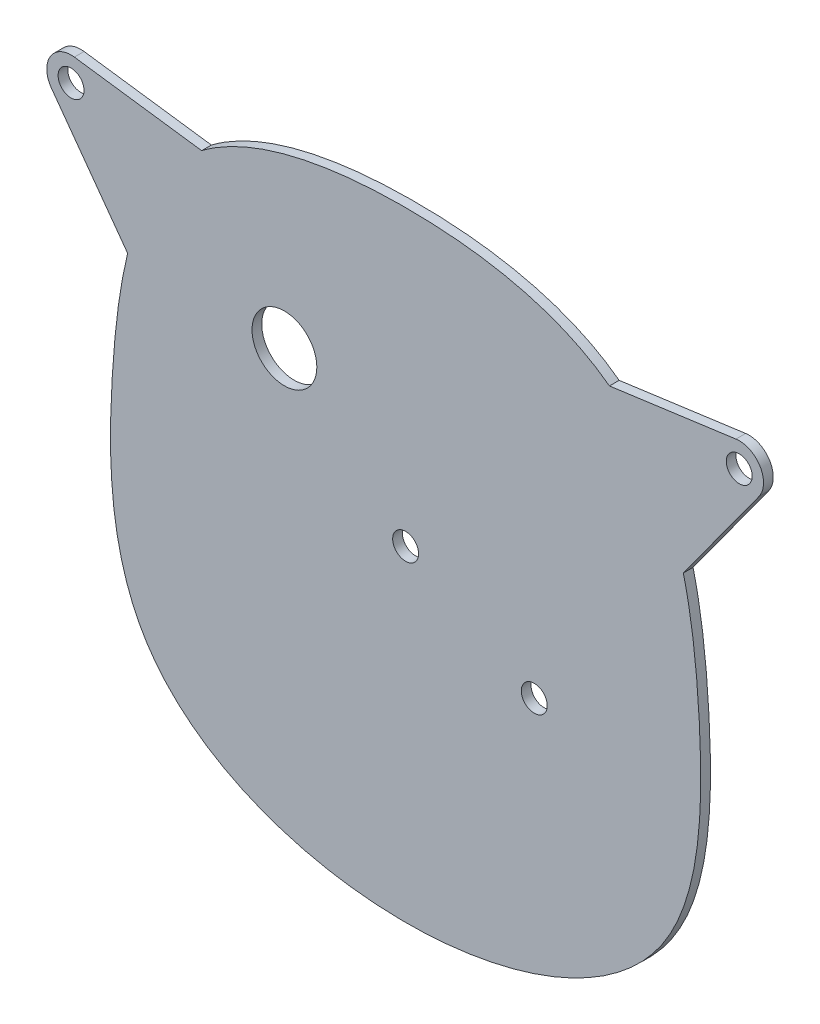
ISO-10303-21;
HEADER;
FILE_DESCRIPTION(('STEP AP214'),'2;1');
FILE_NAME('part.step','',(''),(''),'','','');
FILE_SCHEMA(('AUTOMOTIVE_DESIGN { 1 0 10303 214 1 1 1 1 }'));
ENDSEC;
DATA;
#1=APPLICATION_CONTEXT('core data for automotive mechanical design processes');
#2=APPLICATION_PROTOCOL_DEFINITION('international standard','automotive_design',2000,#1);
#3=PRODUCT_CONTEXT('',#1,'mechanical');
#4=PRODUCT('Part','Part','',(#3));
#5=PRODUCT_RELATED_PRODUCT_CATEGORY('part','',(#4));
#6=PRODUCT_DEFINITION_FORMATION('','',#4);
#7=PRODUCT_DEFINITION_CONTEXT('part definition',#1,'design');
#8=PRODUCT_DEFINITION('design','',#6,#7);
#9=PRODUCT_DEFINITION_SHAPE('','',#8);
#10=(LENGTH_UNIT() NAMED_UNIT(*) SI_UNIT(.MILLI.,.METRE.));
#11=(NAMED_UNIT(*) PLANE_ANGLE_UNIT() SI_UNIT($,.RADIAN.));
#12=(NAMED_UNIT(*) SI_UNIT($,.STERADIAN.) SOLID_ANGLE_UNIT());
#13=UNCERTAINTY_MEASURE_WITH_UNIT(LENGTH_MEASURE(1.E-05),#10,'distance_accuracy_value','');
#14=(GEOMETRIC_REPRESENTATION_CONTEXT(3) GLOBAL_UNCERTAINTY_ASSIGNED_CONTEXT((#13)) GLOBAL_UNIT_ASSIGNED_CONTEXT((#10,
#11,#12)) REPRESENTATION_CONTEXT('',''));
#15=CARTESIAN_POINT('',(0.,0.,0.));
#16=DIRECTION('',(0.,0.,1.));
#17=DIRECTION('',(1.,0.,0.));
#18=AXIS2_PLACEMENT_3D('',#15,#16,#17);
#19=CARTESIAN_POINT('',(-0.0577550519054268,95.5603656816354,3.));
#20=DIRECTION('',(0.,0.,1.));
#21=DIRECTION('',(1.,0.,0.));
#22=AXIS2_PLACEMENT_3D('',#19,#20,#21);
#23=PLANE('',#22);
#24=CARTESIAN_POINT('',(102.883543247524,77.2362190383587,3.));
#25=DIRECTION('',(0.,0.,1.));
#26=DIRECTION('',(1.,0.,0.));
#27=AXIS2_PLACEMENT_3D('',#24,#25,#26);
#28=CIRCLE('',#27,4.00000000000001);
#29=CARTESIAN_POINT('',(106.883543247524,77.2362190383587,3.));
#30=VERTEX_POINT('',#29);
#31=EDGE_CURVE('E339',#30,#30,#28,.T.);
#32=ORIENTED_EDGE('',*,*,#31,.F.);
#33=EDGE_LOOP('',(#32));
#34=FACE_BOUND('',#33,.T.);
#35=CARTESIAN_POINT('',(39.6608312378982,-15.6887366735014,3.));
#36=DIRECTION('',(0.,0.,1.));
#37=DIRECTION('',(1.,0.,0.));
#38=AXIS2_PLACEMENT_3D('',#35,#36,#37);
#39=CIRCLE('',#38,4.0000000115835);
#40=CARTESIAN_POINT('',(43.6608312494817,-15.6887366735014,3.));
#41=VERTEX_POINT('',#40);
#42=EDGE_CURVE('E351',#41,#41,#39,.T.);
#43=ORIENTED_EDGE('',*,*,#42,.F.);
#44=EDGE_LOOP('',(#43));
#45=FACE_BOUND('',#44,.T.);
#46=CARTESIAN_POINT('',(62.8512042395598,79.3404872355241,3.));
#47=CARTESIAN_POINT('',(60.8879174687472,80.8200655627939,3.));
#48=CARTESIAN_POINT('',(53.8097674375605,85.4517683193398,3.));
#49=CARTESIAN_POINT('',(39.8663605925617,91.1117371513544,3.));
#50=CARTESIAN_POINT('',(20.4248934275939,94.8529199799036,3.));
#51=CARTESIAN_POINT('',(6.79160473756205,95.5603683978794,3.));
#52=CARTESIAN_POINT('',(-0.0250396074538525,95.5603683978794,3.));
#53=CARTESIAN_POINT('',(-6.84168395246976,95.5603683978794,3.));
#54=CARTESIAN_POINT('',(-20.4749726425016,94.8529199799036,3.));
#55=CARTESIAN_POINT('',(-39.9164398074694,91.1117371513545,3.));
#56=CARTESIAN_POINT('',(-53.8783269469801,85.4442667171771,3.));
#57=CARTESIAN_POINT('',(-60.9700219168418,80.7990989413774,3.));
#58=CARTESIAN_POINT('',(-62.9467747967644,79.3061670478501,3.));
#59=B_SPLINE_CURVE_WITH_KNOTS('',3,(#46,#47,#48,#49,#50,#51,#52,#53,#54,#55,#56,#57,#58),
.UNSPECIFIED.,.F.,.F.,(4,1,1,1,3,1,1,1,4),(0.893210136455456,0.90615001359331,0.93740001359331,
0.96865001359331,0.99990001359331,1.03115001359331,1.06240001359331,1.09365001359331,
1.10668987713785),.UNSPECIFIED.);
#60=CARTESIAN_POINT('',(62.8512042395598,79.3404872355241,3.));
#61=VERTEX_POINT('',#60);
#62=CARTESIAN_POINT('',(-62.9467747967644,79.3061670478501,3.));
#63=VERTEX_POINT('',#62);
#64=EDGE_CURVE('E156',#61,#63,#59,.T.);
#65=ORIENTED_EDGE('',*,*,#64,.T.);
#66=DIRECTION('',(-0.990809124231326,0.135267436362018,0.));
#67=VECTOR('',#66,1.);
#68=CARTESIAN_POINT('',(-62.9467747967644,79.3061670478501,3.));
#69=LINE('',#68,#67);
#70=CARTESIAN_POINT('',(-102.215997092559,84.6672874674903,3.));
#71=VERTEX_POINT('',#70);
#72=EDGE_CURVE('E94',#63,#71,#69,.T.);
#73=ORIENTED_EDGE('',*,*,#72,.T.);
#74=CARTESIAN_POINT('',(-103.23050286541,77.236219034758,3.));
#75=DIRECTION('',(0.,0.,1.));
#76=DIRECTION('',(1.,0.,0.));
#77=AXIS2_PLACEMENT_3D('',#74,#75,#76);
#78=CIRCLE('',#77,7.50000000100651);
#79=CARTESIAN_POINT('',(-109.297018411226,72.8262996310193,3.));
#80=VERTEX_POINT('',#79);
#81=EDGE_CURVE('E171',#71,#80,#78,.T.);
#82=ORIENTED_EDGE('',*,*,#81,.T.);
#83=DIRECTION('',(0.58798925375293,-0.808868739333566,0.));
#84=VECTOR('',#83,1.);
#85=CARTESIAN_POINT('',(-109.297018411226,72.8262996310193,3.));
#86=LINE('',#85,#84);
#87=CARTESIAN_POINT('',(-85.7735669249831,40.4662106889059,3.));
#88=VERTEX_POINT('',#87);
#89=EDGE_CURVE('E184',#80,#88,#86,.T.);
#90=ORIENTED_EDGE('',*,*,#89,.T.);
#91=CARTESIAN_POINT('',(-85.7735669249831,40.4662106889059,3.));
#92=CARTESIAN_POINT('',(-85.8511091783791,40.1485115314779,3.));
#93=CARTESIAN_POINT('',(-87.4250450361891,33.5866055212239,3.));
#94=CARTESIAN_POINT('',(-89.0322127667217,23.4613451281537,3.));
#95=CARTESIAN_POINT('',(-90.2390196490967,10.1127233092552,3.));
#96=CARTESIAN_POINT('',(-91.0484650788275,-3.23978660476637,3.));
#97=CARTESIAN_POINT('',(-91.2741268025938,-19.8199296303688,3.));
#98=CARTESIAN_POINT('',(-89.5078461447433,-35.6085090177251,3.));
#99=CARTESIAN_POINT('',(-86.3394473294779,-47.3832895066007,3.));
#100=CARTESIAN_POINT('',(-82.9401382188529,-55.6782895298871,3.));
#101=CARTESIAN_POINT('',(-78.3435141502608,-63.3250522266594,3.));
#102=CARTESIAN_POINT('',(-70.5893497709855,-72.4184139893043,3.));
#103=CARTESIAN_POINT('',(-58.3170135581357,-81.7179417703992,3.));
#104=CARTESIAN_POINT('',(-40.5556573062878,-89.639515512568,3.));
#105=CARTESIAN_POINT('',(-20.7915722708147,-94.3834430600468,3.));
#106=CARTESIAN_POINT('',(-0.0250396074538563,-95.9677258731575,3.));
#107=CARTESIAN_POINT('',(20.7414930559071,-94.3834430600468,3.));
#108=CARTESIAN_POINT('',(40.5055780913801,-89.6395155125679,3.));
#109=CARTESIAN_POINT('',(58.266934343228,-81.7179417703992,3.));
#110=CARTESIAN_POINT('',(70.5392705560778,-72.4184139893043,3.));
#111=CARTESIAN_POINT('',(78.2934349353531,-63.3250522266595,3.));
#112=CARTESIAN_POINT('',(82.8900590039453,-55.6782895298871,3.));
#113=CARTESIAN_POINT('',(86.2893681145702,-47.3832895066007,3.));
#114=CARTESIAN_POINT('',(89.4577669298356,-35.6085090177251,3.));
#115=CARTESIAN_POINT('',(91.2240475876861,-19.8199296303689,3.));
#116=CARTESIAN_POINT('',(90.9983858639199,-3.23978660476641,3.));
#117=CARTESIAN_POINT('',(90.188940434189,10.1127233092552,3.));
#118=CARTESIAN_POINT('',(88.982133551814,23.4613451281536,3.));
#119=CARTESIAN_POINT('',(87.3580235646654,33.6933428309795,3.));
#120=CARTESIAN_POINT('',(85.7519419609067,40.3526029865284,3.));
#121=CARTESIAN_POINT('',(85.6485523501818,40.7715298828133,3.));
#122=B_SPLINE_CURVE_WITH_KNOTS('',3,(#91,#92,#93,#94,#95,#96,#97,#98,#99,#100,#101,#102,#103,
#104,#105,#106,#107,#108,#109,#110,#111,#112,#113,#114,#115,#116,#117,#118,#119,#120,#121),
.UNSPECIFIED.,.F.,.F.,(4,1,1,1,1,1,1,1,1,1,1,1,1,1,1,1,1,1,1,1,1,1,1,1,1,1,1,1,4),
(1.18539525333421,1.18698905711832,1.21823905711832,1.23386405711832,1.24948905711832,
1.28073905711832,1.31198905711832,1.32761405711832,1.34323905711832,1.35886405711832,
1.37448905711832,1.40573905711832,1.43698905711832,1.46823905711832,1.49948905711832,
1.53073905711832,1.56198905711832,1.59323905711832,1.62448905711832,1.64011405711832,
1.65573905711832,1.67136405711832,1.68698905711832,1.71823905711832,1.74948905711832,
1.76511405711832,1.78073905711832,1.81198905711832,1.81409380378411),.UNSPECIFIED.);
#123=CARTESIAN_POINT('',(85.6485523501818,40.7715298828133,3.));
#124=VERTEX_POINT('',#123);
#125=EDGE_CURVE('E113',#88,#124,#122,.T.);
#126=ORIENTED_EDGE('',*,*,#125,.T.);
#127=DIRECTION('',(0.58798925364388,0.808868739412838,0.));
#128=VECTOR('',#127,1.);
#129=CARTESIAN_POINT('',(108.950058787674,72.8262996285369,3.));
#130=LINE('',#129,#128);
#131=CARTESIAN_POINT('',(108.950058787674,72.8262996285369,3.));
#132=VERTEX_POINT('',#131);
#133=EDGE_CURVE('E107',#124,#132,#130,.T.);
#134=ORIENTED_EDGE('',*,*,#133,.T.);
#135=CARTESIAN_POINT('',(102.883543247524,77.2362190383587,3.));
#136=DIRECTION('',(0.,0.,1.));
#137=DIRECTION('',(1.,0.,0.));
#138=AXIS2_PLACEMENT_3D('',#135,#136,#137);
#139=CIRCLE('',#138,7.5000000000005);
#140=CARTESIAN_POINT('',(101.869037469125,84.6672874693183,3.));
#141=VERTEX_POINT('',#140);
#142=EDGE_CURVE('E111',#132,#141,#139,.T.);
#143=ORIENTED_EDGE('',*,*,#142,.T.);
#144=DIRECTION('',(-0.990809124227078,-0.135267436393135,0.));
#145=VECTOR('',#144,1.);
#146=CARTESIAN_POINT('',(62.8512042395598,79.3404872355241,3.));
#147=LINE('',#146,#145);
#148=EDGE_CURVE('E51',#141,#61,#147,.T.);
#149=ORIENTED_EDGE('',*,*,#148,.T.);
#150=EDGE_LOOP('',(#65,#73,#82,#90,#126,#134,#143,#149));
#151=FACE_BOUND('',#150,.T.);
#152=CARTESIAN_POINT('',(-0.0250396149657495,5.06036839965765,3.));
#153=DIRECTION('',(0.,0.,1.));
#154=DIRECTION('',(1.,0.,0.));
#155=AXIS2_PLACEMENT_3D('',#152,#153,#154);
#156=CIRCLE('',#155,4.);
#157=CARTESIAN_POINT('',(3.97496038503425,5.06036839965765,3.));
#158=VERTEX_POINT('',#157);
#159=EDGE_CURVE('E137',#158,#158,#156,.T.);
#160=ORIENTED_EDGE('',*,*,#159,.F.);
#161=EDGE_LOOP('',(#160));
#162=FACE_BOUND('',#161,.T.);
#163=CARTESIAN_POINT('',(-103.23050286541,77.236219034758,3.));
#164=DIRECTION('',(0.,0.,1.));
#165=DIRECTION('',(1.,0.,0.));
#166=AXIS2_PLACEMENT_3D('',#163,#164,#165);
#167=CIRCLE('',#166,4.00000000000001);
#168=CARTESIAN_POINT('',(-99.2305028654102,77.236219034758,3.));
#169=VERTEX_POINT('',#168);
#170=EDGE_CURVE('E345',#169,#169,#167,.T.);
#171=ORIENTED_EDGE('',*,*,#170,.F.);
#172=EDGE_LOOP('',(#171));
#173=FACE_BOUND('',#172,.T.);
#174=CARTESIAN_POINT('',(-37.4125721764809,39.2362190367203,3.));
#175=DIRECTION('',(0.,0.,1.));
#176=DIRECTION('',(1.,0.,0.));
#177=AXIS2_PLACEMENT_3D('',#174,#175,#176);
#178=CIRCLE('',#177,10.);
#179=CARTESIAN_POINT('',(-27.4125721764809,39.2362190367203,3.));
#180=VERTEX_POINT('',#179);
#181=EDGE_CURVE('E330',#180,#180,#178,.T.);
#182=ORIENTED_EDGE('',*,*,#181,.F.);
#183=EDGE_LOOP('',(#182));
#184=FACE_BOUND('',#183,.T.);
#185=ADVANCED_FACE('F33',(#34,#45,#151,#162,#173,#184),#23,.T.);
#186=CARTESIAN_POINT('',(-0.0577550519054268,95.5603656816354,0.));
#187=DIRECTION('',(0.,0.,1.));
#188=DIRECTION('',(1.,0.,0.));
#189=AXIS2_PLACEMENT_3D('',#186,#187,#188);
#190=PLANE('',#189);
#191=CARTESIAN_POINT('',(62.8512042395598,79.3404872355241,0.));
#192=CARTESIAN_POINT('',(60.8879174687472,80.8200655627939,0.));
#193=CARTESIAN_POINT('',(53.8097674375605,85.4517683193398,0.));
#194=CARTESIAN_POINT('',(39.8663605925617,91.1117371513544,0.));
#195=CARTESIAN_POINT('',(20.4248934275939,94.8529199799036,0.));
#196=CARTESIAN_POINT('',(6.79160473756205,95.5603683978794,0.));
#197=CARTESIAN_POINT('',(-0.0250396074538525,95.5603683978794,0.));
#198=CARTESIAN_POINT('',(-6.84168395246976,95.5603683978794,0.));
#199=CARTESIAN_POINT('',(-20.4749726425016,94.8529199799036,0.));
#200=CARTESIAN_POINT('',(-39.9164398074694,91.1117371513545,0.));
#201=CARTESIAN_POINT('',(-53.8783269469801,85.4442667171771,0.));
#202=CARTESIAN_POINT('',(-60.9700219168418,80.7990989413774,0.));
#203=CARTESIAN_POINT('',(-62.9467747967644,79.3061670478501,0.));
#204=B_SPLINE_CURVE_WITH_KNOTS('',3,(#191,#192,#193,#194,#195,#196,#197,#198,#199,#200,#201,
#202,#203),.UNSPECIFIED.,.F.,.F.,(4,1,1,1,3,1,1,1,4),(0.893210136455456,0.90615001359331,
0.93740001359331,0.96865001359331,0.99990001359331,1.03115001359331,1.06240001359331,
1.09365001359331,1.10668987713785),.UNSPECIFIED.);
#205=CARTESIAN_POINT('',(62.8512042395598,79.3404872355241,0.));
#206=VERTEX_POINT('',#205);
#207=CARTESIAN_POINT('',(-62.9467747967644,79.3061670478501,0.));
#208=VERTEX_POINT('',#207);
#209=EDGE_CURVE('E131',#206,#208,#204,.T.);
#210=ORIENTED_EDGE('',*,*,#209,.F.);
#211=DIRECTION('',(-0.990809124227078,-0.135267436393135,0.));
#212=VECTOR('',#211,1.);
#213=CARTESIAN_POINT('',(62.8512042395598,79.3404872355241,0.));
#214=LINE('',#213,#212);
#215=CARTESIAN_POINT('',(101.869037469125,84.6672874693183,0.));
#216=VERTEX_POINT('',#215);
#217=EDGE_CURVE('E86',#216,#206,#214,.T.);
#218=ORIENTED_EDGE('',*,*,#217,.F.);
#219=CARTESIAN_POINT('',(102.883543247524,77.2362190383587,0.));
#220=DIRECTION('',(0.,0.,1.));
#221=DIRECTION('',(1.,0.,0.));
#222=AXIS2_PLACEMENT_3D('',#219,#220,#221);
#223=CIRCLE('',#222,7.5000000000005);
#224=CARTESIAN_POINT('',(108.950058787674,72.8262996285369,0.));
#225=VERTEX_POINT('',#224);
#226=EDGE_CURVE('E80',#225,#216,#223,.T.);
#227=ORIENTED_EDGE('',*,*,#226,.F.);
#228=DIRECTION('',(0.58798925364388,0.808868739412838,0.));
#229=VECTOR('',#228,1.);
#230=CARTESIAN_POINT('',(108.950058787674,72.8262996285369,0.));
#231=LINE('',#230,#229);
#232=CARTESIAN_POINT('',(85.6485523501818,40.7715298828133,0.));
#233=VERTEX_POINT('',#232);
#234=EDGE_CURVE('E121',#233,#225,#231,.T.);
#235=ORIENTED_EDGE('',*,*,#234,.F.);
#236=CARTESIAN_POINT('',(-85.7735669249831,40.4662106889059,0.));
#237=CARTESIAN_POINT('',(-85.8511091783791,40.1485115314779,0.));
#238=CARTESIAN_POINT('',(-87.4250450361891,33.5866055212239,0.));
#239=CARTESIAN_POINT('',(-89.0322127667217,23.4613451281537,0.));
#240=CARTESIAN_POINT('',(-90.2390196490967,10.1127233092552,0.));
#241=CARTESIAN_POINT('',(-91.0484650788275,-3.23978660476637,0.));
#242=CARTESIAN_POINT('',(-91.2741268025938,-19.8199296303688,0.));
#243=CARTESIAN_POINT('',(-89.5078461447433,-35.6085090177251,0.));
#244=CARTESIAN_POINT('',(-86.3394473294779,-47.3832895066007,0.));
#245=CARTESIAN_POINT('',(-82.9401382188529,-55.6782895298871,0.));
#246=CARTESIAN_POINT('',(-78.3435141502608,-63.3250522266594,0.));
#247=CARTESIAN_POINT('',(-70.5893497709855,-72.4184139893043,0.));
#248=CARTESIAN_POINT('',(-58.3170135581357,-81.7179417703992,0.));
#249=CARTESIAN_POINT('',(-40.5556573062878,-89.639515512568,0.));
#250=CARTESIAN_POINT('',(-20.7915722708147,-94.3834430600468,0.));
#251=CARTESIAN_POINT('',(-0.0250396074538563,-95.9677258731575,0.));
#252=CARTESIAN_POINT('',(20.7414930559071,-94.3834430600468,0.));
#253=CARTESIAN_POINT('',(40.5055780913801,-89.6395155125679,0.));
#254=CARTESIAN_POINT('',(58.266934343228,-81.7179417703992,0.));
#255=CARTESIAN_POINT('',(70.5392705560778,-72.4184139893043,0.));
#256=CARTESIAN_POINT('',(78.2934349353531,-63.3250522266595,0.));
#257=CARTESIAN_POINT('',(82.8900590039453,-55.6782895298871,0.));
#258=CARTESIAN_POINT('',(86.2893681145702,-47.3832895066007,0.));
#259=CARTESIAN_POINT('',(89.4577669298356,-35.6085090177251,0.));
#260=CARTESIAN_POINT('',(91.2240475876861,-19.8199296303689,0.));
#261=CARTESIAN_POINT('',(90.9983858639199,-3.23978660476641,0.));
#262=CARTESIAN_POINT('',(90.188940434189,10.1127233092552,0.));
#263=CARTESIAN_POINT('',(88.982133551814,23.4613451281536,0.));
#264=CARTESIAN_POINT('',(87.3580235646654,33.6933428309795,0.));
#265=CARTESIAN_POINT('',(85.7519419609067,40.3526029865284,0.));
#266=CARTESIAN_POINT('',(85.6485523501818,40.7715298828133,0.));
#267=B_SPLINE_CURVE_WITH_KNOTS('',3,(#236,#237,#238,#239,#240,#241,#242,#243,#244,#245,#246,
#247,#248,#249,#250,#251,#252,#253,#254,#255,#256,#257,#258,#259,#260,#261,#262,#263,#264,#265,
#266),.UNSPECIFIED.,.F.,.F.,(4,1,1,1,1,1,1,1,1,1,1,1,1,1,1,1,1,1,1,1,1,1,1,1,1,1,1,1,4),
(1.18539525333421,1.18698905711832,1.21823905711832,1.23386405711832,1.24948905711832,
1.28073905711832,1.31198905711832,1.32761405711832,1.34323905711832,1.35886405711832,
1.37448905711832,1.40573905711832,1.43698905711832,1.46823905711832,1.49948905711832,
1.53073905711832,1.56198905711832,1.59323905711832,1.62448905711832,1.64011405711832,
1.65573905711832,1.67136405711832,1.68698905711832,1.71823905711832,1.74948905711832,
1.76511405711832,1.78073905711832,1.81198905711832,1.81409380378411),.UNSPECIFIED.);
#268=CARTESIAN_POINT('',(-85.7735669249831,40.4662106889059,0.));
#269=VERTEX_POINT('',#268);
#270=EDGE_CURVE('E146',#269,#233,#267,.T.);
#271=ORIENTED_EDGE('',*,*,#270,.F.);
#272=DIRECTION('',(0.58798925375293,-0.808868739333566,0.));
#273=VECTOR('',#272,1.);
#274=CARTESIAN_POINT('',(-109.297018411226,72.8262996310193,0.));
#275=LINE('',#274,#273);
#276=CARTESIAN_POINT('',(-109.297018411226,72.8262996310193,0.));
#277=VERTEX_POINT('',#276);
#278=EDGE_CURVE('E144',#277,#269,#275,.T.);
#279=ORIENTED_EDGE('',*,*,#278,.F.);
#280=CARTESIAN_POINT('',(-103.23050286541,77.236219034758,0.));
#281=DIRECTION('',(0.,0.,1.));
#282=DIRECTION('',(1.,0.,0.));
#283=AXIS2_PLACEMENT_3D('',#280,#281,#282);
#284=CIRCLE('',#283,7.50000000100651);
#285=CARTESIAN_POINT('',(-102.215997092559,84.6672874674903,0.));
#286=VERTEX_POINT('',#285);
#287=EDGE_CURVE('E142',#286,#277,#284,.T.);
#288=ORIENTED_EDGE('',*,*,#287,.F.);
#289=DIRECTION('',(-0.990809124231326,0.135267436362018,0.));
#290=VECTOR('',#289,1.);
#291=CARTESIAN_POINT('',(-62.9467747967644,79.3061670478501,0.));
#292=LINE('',#291,#290);
#293=EDGE_CURVE('E136',#208,#286,#292,.T.);
#294=ORIENTED_EDGE('',*,*,#293,.F.);
#295=EDGE_LOOP('',(#210,#218,#227,#235,#271,#279,#288,#294));
#296=FACE_BOUND('',#295,.T.);
#297=CARTESIAN_POINT('',(-0.0250396149657495,5.06036839965765,0.));
#298=DIRECTION('',(0.,0.,1.));
#299=DIRECTION('',(1.,0.,0.));
#300=AXIS2_PLACEMENT_3D('',#297,#298,#299);
#301=CIRCLE('',#300,4.);
#302=CARTESIAN_POINT('',(3.97496038503425,5.06036839965765,0.));
#303=VERTEX_POINT('',#302);
#304=EDGE_CURVE('E354',#303,#303,#301,.T.);
#305=ORIENTED_EDGE('',*,*,#304,.T.);
#306=EDGE_LOOP('',(#305));
#307=FACE_BOUND('',#306,.T.);
#308=CARTESIAN_POINT('',(39.6608312378982,-15.6887366735014,0.));
#309=DIRECTION('',(0.,0.,1.));
#310=DIRECTION('',(1.,0.,0.));
#311=AXIS2_PLACEMENT_3D('',#308,#309,#310);
#312=CIRCLE('',#311,4.0000000115835);
#313=CARTESIAN_POINT('',(43.6608312494817,-15.6887366735014,0.));
#314=VERTEX_POINT('',#313);
#315=EDGE_CURVE('E348',#314,#314,#312,.T.);
#316=ORIENTED_EDGE('',*,*,#315,.T.);
#317=EDGE_LOOP('',(#316));
#318=FACE_BOUND('',#317,.T.);
#319=CARTESIAN_POINT('',(-103.23050286541,77.236219034758,0.));
#320=DIRECTION('',(0.,0.,1.));
#321=DIRECTION('',(1.,0.,0.));
#322=AXIS2_PLACEMENT_3D('',#319,#320,#321);
#323=CIRCLE('',#322,4.00000000000001);
#324=CARTESIAN_POINT('',(-99.2305028654102,77.236219034758,0.));
#325=VERTEX_POINT('',#324);
#326=EDGE_CURVE('E342',#325,#325,#323,.T.);
#327=ORIENTED_EDGE('',*,*,#326,.T.);
#328=EDGE_LOOP('',(#327));
#329=FACE_BOUND('',#328,.T.);
#330=CARTESIAN_POINT('',(102.883543247524,77.2362190383587,0.));
#331=DIRECTION('',(0.,0.,1.));
#332=DIRECTION('',(1.,0.,0.));
#333=AXIS2_PLACEMENT_3D('',#330,#331,#332);
#334=CIRCLE('',#333,4.00000000000001);
#335=CARTESIAN_POINT('',(106.883543247524,77.2362190383587,0.));
#336=VERTEX_POINT('',#335);
#337=EDGE_CURVE('E336',#336,#336,#334,.T.);
#338=ORIENTED_EDGE('',*,*,#337,.T.);
#339=EDGE_LOOP('',(#338));
#340=FACE_BOUND('',#339,.T.);
#341=CARTESIAN_POINT('',(-37.4125721764809,39.2362190367203,0.));
#342=DIRECTION('',(0.,0.,1.));
#343=DIRECTION('',(1.,0.,0.));
#344=AXIS2_PLACEMENT_3D('',#341,#342,#343);
#345=CIRCLE('',#344,10.);
#346=CARTESIAN_POINT('',(-27.4125721764809,39.2362190367203,0.));
#347=VERTEX_POINT('',#346);
#348=EDGE_CURVE('E333',#347,#347,#345,.T.);
#349=ORIENTED_EDGE('',*,*,#348,.T.);
#350=EDGE_LOOP('',(#349));
#351=FACE_BOUND('',#350,.T.);
#352=ADVANCED_FACE('F175',(#296,#307,#318,#329,#340,#351),#190,.F.);
#353=DIRECTION('',(0.,0.,-1.));
#354=VECTOR('',#353,1.);
#355=SURFACE_OF_LINEAR_EXTRUSION('',#59,#354);
#356=ORIENTED_EDGE('',*,*,#209,.T.);
#357=DIRECTION('',(0.,0.,-1.));
#358=VECTOR('',#357,1.);
#359=CARTESIAN_POINT('',(-62.9467747967644,79.3061670478501,3.));
#360=LINE('',#359,#358);
#361=EDGE_CURVE('E11',#63,#208,#360,.T.);
#362=ORIENTED_EDGE('',*,*,#361,.F.);
#363=ORIENTED_EDGE('',*,*,#64,.F.);
#364=DIRECTION('',(0.,0.,-1.));
#365=VECTOR('',#364,1.);
#366=CARTESIAN_POINT('',(62.8512042395598,79.3404872355241,3.));
#367=LINE('',#366,#365);
#368=EDGE_CURVE('E127',#61,#206,#367,.T.);
#369=ORIENTED_EDGE('',*,*,#368,.T.);
#370=EDGE_LOOP('',(#356,#362,#363,#369));
#371=FACE_BOUND('',#370,.T.);
#372=ADVANCED_FACE('F35',(#371),#355,.F.);
#373=CARTESIAN_POINT('',(-62.9467747967644,79.3061670478501,3.));
#374=DIRECTION('',(-0.135267436362018,-0.990809124231326,0.));
#375=DIRECTION('',(0.990809124231326,-0.135267436362018,0.));
#376=AXIS2_PLACEMENT_3D('',#373,#374,#375);
#377=PLANE('',#376);
#378=ORIENTED_EDGE('',*,*,#293,.T.);
#379=DIRECTION('',(0.,0.,-1.));
#380=VECTOR('',#379,1.);
#381=CARTESIAN_POINT('',(-102.215997092559,84.6672874674903,3.));
#382=LINE('',#381,#380);
#383=EDGE_CURVE('E43',#71,#286,#382,.T.);
#384=ORIENTED_EDGE('',*,*,#383,.F.);
#385=ORIENTED_EDGE('',*,*,#72,.F.);
#386=ORIENTED_EDGE('',*,*,#361,.T.);
#387=EDGE_LOOP('',(#378,#384,#385,#386));
#388=FACE_BOUND('',#387,.T.);
#389=ADVANCED_FACE('F201',(#388),#377,.F.);
#390=CARTESIAN_POINT('',(-103.23050286541,77.236219034758,3.));
#391=DIRECTION('',(0.,0.,-1.));
#392=DIRECTION('',(-1.,0.,0.));
#393=AXIS2_PLACEMENT_3D('',#390,#391,#392);
#394=CYLINDRICAL_SURFACE('',#393,7.50000000100651);
#395=ORIENTED_EDGE('',*,*,#287,.T.);
#396=DIRECTION('',(0.,0.,-1.));
#397=VECTOR('',#396,1.);
#398=CARTESIAN_POINT('',(-109.297018411226,72.8262996310193,3.));
#399=LINE('',#398,#397);
#400=EDGE_CURVE('E163',#80,#277,#399,.T.);
#401=ORIENTED_EDGE('',*,*,#400,.F.);
#402=ORIENTED_EDGE('',*,*,#81,.F.);
#403=ORIENTED_EDGE('',*,*,#383,.T.);
#404=EDGE_LOOP('',(#395,#401,#402,#403));
#405=FACE_BOUND('',#404,.T.);
#406=ADVANCED_FACE('F169',(#405),#394,.T.);
#407=CARTESIAN_POINT('',(-109.297018411226,72.8262996310193,3.));
#408=DIRECTION('',(0.808868739333566,0.58798925375293,0.));
#409=DIRECTION('',(-0.58798925375293,0.808868739333566,0.));
#410=AXIS2_PLACEMENT_3D('',#407,#408,#409);
#411=PLANE('',#410);
#412=ORIENTED_EDGE('',*,*,#278,.T.);
#413=DIRECTION('',(0.,0.,-1.));
#414=VECTOR('',#413,1.);
#415=CARTESIAN_POINT('',(-85.7735669249831,40.4662106889059,3.));
#416=LINE('',#415,#414);
#417=EDGE_CURVE('E160',#88,#269,#416,.T.);
#418=ORIENTED_EDGE('',*,*,#417,.F.);
#419=ORIENTED_EDGE('',*,*,#89,.F.);
#420=ORIENTED_EDGE('',*,*,#400,.T.);
#421=EDGE_LOOP('',(#412,#418,#419,#420));
#422=FACE_BOUND('',#421,.T.);
#423=ADVANCED_FACE('F180',(#422),#411,.F.);
#424=DIRECTION('',(0.,0.,-1.));
#425=VECTOR('',#424,1.);
#426=SURFACE_OF_LINEAR_EXTRUSION('',#122,#425);
#427=ORIENTED_EDGE('',*,*,#270,.T.);
#428=DIRECTION('',(0.,0.,-1.));
#429=VECTOR('',#428,1.);
#430=CARTESIAN_POINT('',(85.6485523501818,40.7715298828133,3.));
#431=LINE('',#430,#429);
#432=EDGE_CURVE('E122',#124,#233,#431,.T.);
#433=ORIENTED_EDGE('',*,*,#432,.F.);
#434=ORIENTED_EDGE('',*,*,#125,.F.);
#435=ORIENTED_EDGE('',*,*,#417,.T.);
#436=EDGE_LOOP('',(#427,#433,#434,#435));
#437=FACE_BOUND('',#436,.T.);
#438=ADVANCED_FACE('F183',(#437),#426,.F.);
#439=CARTESIAN_POINT('',(108.950058787674,72.8262996285369,3.));
#440=DIRECTION('',(-0.808868739412837,0.58798925364388,0.));
#441=DIRECTION('',(-0.58798925364388,-0.808868739412838,0.));
#442=AXIS2_PLACEMENT_3D('',#439,#440,#441);
#443=PLANE('',#442);
#444=ORIENTED_EDGE('',*,*,#234,.T.);
#445=DIRECTION('',(0.,0.,-1.));
#446=VECTOR('',#445,1.);
#447=CARTESIAN_POINT('',(108.950058787674,72.8262996285369,3.));
#448=LINE('',#447,#446);
#449=EDGE_CURVE('E118',#132,#225,#448,.T.);
#450=ORIENTED_EDGE('',*,*,#449,.F.);
#451=ORIENTED_EDGE('',*,*,#133,.F.);
#452=ORIENTED_EDGE('',*,*,#432,.T.);
#453=EDGE_LOOP('',(#444,#450,#451,#452));
#454=FACE_BOUND('',#453,.T.);
#455=ADVANCED_FACE('F119',(#454),#443,.F.);
#456=CARTESIAN_POINT('',(102.883543247524,77.2362190383587,3.));
#457=DIRECTION('',(0.,0.,-1.));
#458=DIRECTION('',(-1.,0.,0.));
#459=AXIS2_PLACEMENT_3D('',#456,#457,#458);
#460=CYLINDRICAL_SURFACE('',#459,7.5000000000005);
#461=ORIENTED_EDGE('',*,*,#226,.T.);
#462=DIRECTION('',(0.,0.,-1.));
#463=VECTOR('',#462,1.);
#464=CARTESIAN_POINT('',(101.869037469125,84.6672874693183,3.));
#465=LINE('',#464,#463);
#466=EDGE_CURVE('E123',#141,#216,#465,.T.);
#467=ORIENTED_EDGE('',*,*,#466,.F.);
#468=ORIENTED_EDGE('',*,*,#142,.F.);
#469=ORIENTED_EDGE('',*,*,#449,.T.);
#470=EDGE_LOOP('',(#461,#467,#468,#469));
#471=FACE_BOUND('',#470,.T.);
#472=ADVANCED_FACE('F125',(#471),#460,.T.);
#473=CARTESIAN_POINT('',(62.8512042395598,79.3404872355241,3.));
#474=DIRECTION('',(0.135267436393135,-0.990809124227078,0.));
#475=DIRECTION('',(0.990809124227078,0.135267436393135,0.));
#476=AXIS2_PLACEMENT_3D('',#473,#474,#475);
#477=PLANE('',#476);
#478=ORIENTED_EDGE('',*,*,#217,.T.);
#479=ORIENTED_EDGE('',*,*,#368,.F.);
#480=ORIENTED_EDGE('',*,*,#148,.F.);
#481=ORIENTED_EDGE('',*,*,#466,.T.);
#482=EDGE_LOOP('',(#478,#479,#480,#481));
#483=FACE_BOUND('',#482,.T.);
#484=ADVANCED_FACE('F220',(#483),#477,.F.);
#485=CARTESIAN_POINT('',(-0.0250396149657495,5.06036839965765,3.));
#486=DIRECTION('',(0.,0.,-1.));
#487=DIRECTION('',(-1.,0.,0.));
#488=AXIS2_PLACEMENT_3D('',#485,#486,#487);
#489=CYLINDRICAL_SURFACE('',#488,4.);
#490=ORIENTED_EDGE('',*,*,#159,.T.);
#491=EDGE_LOOP('',(#490));
#492=FACE_BOUND('',#491,.T.);
#493=ORIENTED_EDGE('',*,*,#304,.F.);
#494=EDGE_LOOP('',(#493));
#495=FACE_BOUND('',#494,.T.);
#496=ADVANCED_FACE('F217',(#492,#495),#489,.F.);
#497=CARTESIAN_POINT('',(39.6608312378982,-15.6887366735014,3.));
#498=DIRECTION('',(0.,0.,-1.));
#499=DIRECTION('',(-1.,0.,0.));
#500=AXIS2_PLACEMENT_3D('',#497,#498,#499);
#501=CYLINDRICAL_SURFACE('',#500,4.0000000115835);
#502=ORIENTED_EDGE('',*,*,#42,.T.);
#503=EDGE_LOOP('',(#502));
#504=FACE_BOUND('',#503,.T.);
#505=ORIENTED_EDGE('',*,*,#315,.F.);
#506=EDGE_LOOP('',(#505));
#507=FACE_BOUND('',#506,.T.);
#508=ADVANCED_FACE('F285',(#504,#507),#501,.F.);
#509=CARTESIAN_POINT('',(-103.23050286541,77.236219034758,3.));
#510=DIRECTION('',(0.,0.,-1.));
#511=DIRECTION('',(-1.,0.,0.));
#512=AXIS2_PLACEMENT_3D('',#509,#510,#511);
#513=CYLINDRICAL_SURFACE('',#512,4.00000000000001);
#514=ORIENTED_EDGE('',*,*,#170,.T.);
#515=EDGE_LOOP('',(#514));
#516=FACE_BOUND('',#515,.T.);
#517=ORIENTED_EDGE('',*,*,#326,.F.);
#518=EDGE_LOOP('',(#517));
#519=FACE_BOUND('',#518,.T.);
#520=ADVANCED_FACE('F293',(#516,#519),#513,.F.);
#521=CARTESIAN_POINT('',(102.883543247524,77.2362190383587,3.));
#522=DIRECTION('',(0.,0.,-1.));
#523=DIRECTION('',(-1.,0.,0.));
#524=AXIS2_PLACEMENT_3D('',#521,#522,#523);
#525=CYLINDRICAL_SURFACE('',#524,4.00000000000001);
#526=ORIENTED_EDGE('',*,*,#31,.T.);
#527=EDGE_LOOP('',(#526));
#528=FACE_BOUND('',#527,.T.);
#529=ORIENTED_EDGE('',*,*,#337,.F.);
#530=EDGE_LOOP('',(#529));
#531=FACE_BOUND('',#530,.T.);
#532=ADVANCED_FACE('F301',(#528,#531),#525,.F.);
#533=CARTESIAN_POINT('',(-37.4125721764809,39.2362190367203,3.));
#534=DIRECTION('',(0.,0.,-1.));
#535=DIRECTION('',(-1.,0.,0.));
#536=AXIS2_PLACEMENT_3D('',#533,#534,#535);
#537=CYLINDRICAL_SURFACE('',#536,10.);
#538=ORIENTED_EDGE('',*,*,#181,.T.);
#539=EDGE_LOOP('',(#538));
#540=FACE_BOUND('',#539,.T.);
#541=ORIENTED_EDGE('',*,*,#348,.F.);
#542=EDGE_LOOP('',(#541));
#543=FACE_BOUND('',#542,.T.);
#544=ADVANCED_FACE('F310',(#540,#543),#537,.F.);
#545=CLOSED_SHELL('',(#185,#352,#372,#389,#406,#423,#438,#455,#472,#484,#496,#508,#520,#532,#544));
#546=MANIFOLD_SOLID_BREP('B2',#545);
#547=ADVANCED_BREP_SHAPE_REPRESENTATION('',(#18,#546),#14);
#548=SHAPE_DEFINITION_REPRESENTATION(#9,#547);
ENDSEC;
END-ISO-10303-21;
